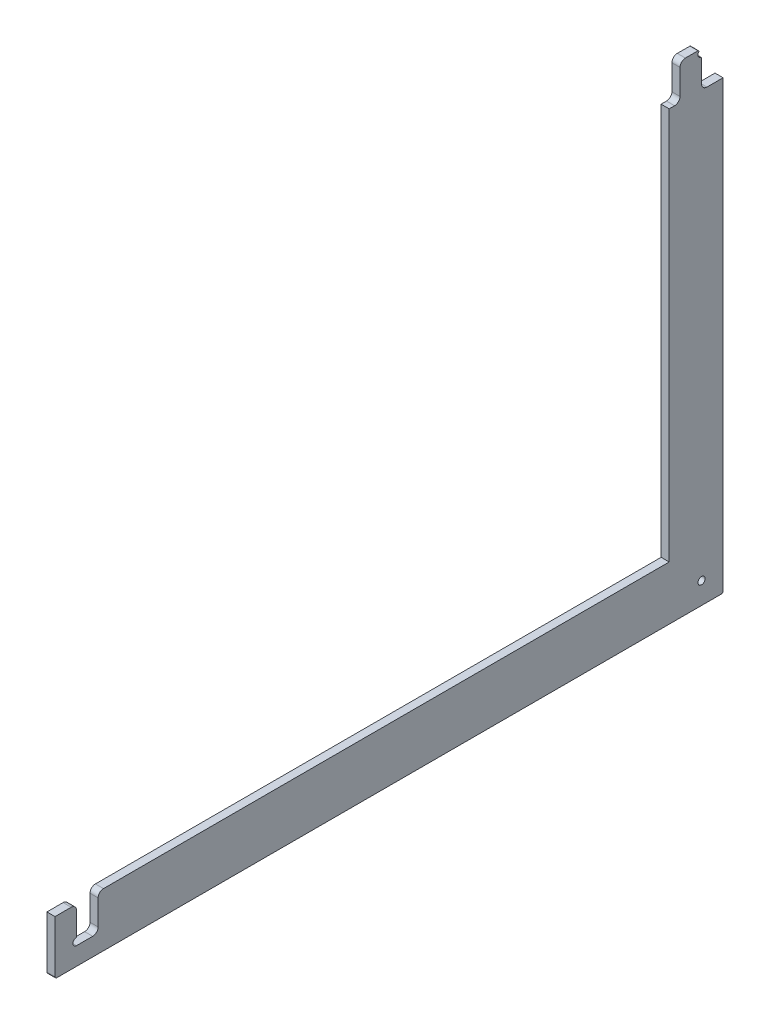
ISO-10303-21;
HEADER;
FILE_DESCRIPTION(('STEP AP214'),'2;1');
FILE_NAME('part.step','',(''),(''),'','','');
FILE_SCHEMA(('AUTOMOTIVE_DESIGN { 1 0 10303 214 1 1 1 1 }'));
ENDSEC;
DATA;
#1=APPLICATION_CONTEXT('core data for automotive mechanical design processes');
#2=APPLICATION_PROTOCOL_DEFINITION('international standard','automotive_design',2000,#1);
#3=PRODUCT_CONTEXT('',#1,'mechanical');
#4=PRODUCT('Part','Part','',(#3));
#5=PRODUCT_RELATED_PRODUCT_CATEGORY('part','',(#4));
#6=PRODUCT_DEFINITION_FORMATION('','',#4);
#7=PRODUCT_DEFINITION_CONTEXT('part definition',#1,'design');
#8=PRODUCT_DEFINITION('design','',#6,#7);
#9=PRODUCT_DEFINITION_SHAPE('','',#8);
#10=(LENGTH_UNIT() NAMED_UNIT(*) SI_UNIT(.MILLI.,.METRE.));
#11=(NAMED_UNIT(*) PLANE_ANGLE_UNIT() SI_UNIT($,.RADIAN.));
#12=(NAMED_UNIT(*) SI_UNIT($,.STERADIAN.) SOLID_ANGLE_UNIT());
#13=UNCERTAINTY_MEASURE_WITH_UNIT(LENGTH_MEASURE(1.E-05),#10,'distance_accuracy_value','');
#14=(GEOMETRIC_REPRESENTATION_CONTEXT(3) GLOBAL_UNCERTAINTY_ASSIGNED_CONTEXT((#13)) GLOBAL_UNIT_ASSIGNED_CONTEXT((#10,
#11,#12)) REPRESENTATION_CONTEXT('',''));
#15=CARTESIAN_POINT('',(0.,0.,0.));
#16=DIRECTION('',(0.,0.,1.));
#17=DIRECTION('',(1.,0.,0.));
#18=AXIS2_PLACEMENT_3D('',#15,#16,#17);
#19=CARTESIAN_POINT('',(4.5,0.,0.));
#20=DIRECTION('',(-1.,0.,0.));
#21=DIRECTION('',(0.,0.,1.));
#22=AXIS2_PLACEMENT_3D('',#19,#20,#21);
#23=PLANE('',#22);
#24=DIRECTION('',(0.,-1.,0.));
#25=VECTOR('',#24,1.);
#26=CARTESIAN_POINT('',(4.5,0.,372.));
#27=LINE('',#26,#25);
#28=CARTESIAN_POINT('',(4.5,30.,372.));
#29=VERTEX_POINT('',#28);
#30=CARTESIAN_POINT('',(4.5,1.,372.));
#31=VERTEX_POINT('',#30);
#32=EDGE_CURVE('E362',#29,#31,#27,.T.);
#33=ORIENTED_EDGE('',*,*,#32,.T.);
#34=CARTESIAN_POINT('',(4.5,1.,371.));
#35=DIRECTION('',(-1.,0.,0.));
#36=DIRECTION('',(0.,0.,1.));
#37=AXIS2_PLACEMENT_3D('',#34,#35,#36);
#38=CIRCLE('',#37,1.);
#39=CARTESIAN_POINT('',(4.5,0.,371.));
#40=VERTEX_POINT('',#39);
#41=EDGE_CURVE('E45',#31,#40,#38,.F.);
#42=ORIENTED_EDGE('',*,*,#41,.T.);
#43=DIRECTION('',(0.,0.,-1.));
#44=VECTOR('',#43,1.);
#45=CARTESIAN_POINT('',(4.5,0.,0.));
#46=LINE('',#45,#44);
#47=CARTESIAN_POINT('',(4.5,0.,1.));
#48=VERTEX_POINT('',#47);
#49=EDGE_CURVE('E361',#40,#48,#46,.T.);
#50=ORIENTED_EDGE('',*,*,#49,.T.);
#51=CARTESIAN_POINT('',(4.5,1.,1.));
#52=DIRECTION('',(-1.,0.,0.));
#53=DIRECTION('',(0.,0.,1.));
#54=AXIS2_PLACEMENT_3D('',#51,#52,#53);
#55=CIRCLE('',#54,1.);
#56=CARTESIAN_POINT('',(4.5,1.00000000000006,0.));
#57=VERTEX_POINT('',#56);
#58=EDGE_CURVE('E52',#48,#57,#55,.F.);
#59=ORIENTED_EDGE('',*,*,#58,.T.);
#60=DIRECTION('',(0.,1.,0.));
#61=VECTOR('',#60,1.);
#62=CARTESIAN_POINT('',(4.5,248.5,0.));
#63=LINE('',#62,#61);
#64=CARTESIAN_POINT('',(4.5,248.5,0.));
#65=VERTEX_POINT('',#64);
#66=EDGE_CURVE('E370',#57,#65,#63,.T.);
#67=ORIENTED_EDGE('',*,*,#66,.T.);
#68=DIRECTION('',(0.,0.,1.));
#69=VECTOR('',#68,1.);
#70=CARTESIAN_POINT('',(4.5,248.5,12.0000000000001));
#71=LINE('',#70,#69);
#72=CARTESIAN_POINT('',(4.5,248.5,9.00000000000008));
#73=VERTEX_POINT('',#72);
#74=EDGE_CURVE('E422',#65,#73,#71,.T.);
#75=ORIENTED_EDGE('',*,*,#74,.T.);
#76=CARTESIAN_POINT('',(4.5,251.5,9.00000000000008));
#77=DIRECTION('',(-1.,0.,0.));
#78=DIRECTION('',(0.,0.,1.));
#79=AXIS2_PLACEMENT_3D('',#76,#77,#78);
#80=CIRCLE('',#79,3.);
#81=CARTESIAN_POINT('',(4.5,251.5,12.0000000000001));
#82=VERTEX_POINT('',#81);
#83=EDGE_CURVE('E331',#73,#82,#80,.T.);
#84=ORIENTED_EDGE('',*,*,#83,.T.);
#85=DIRECTION('',(0.,1.,0.));
#86=VECTOR('',#85,1.);
#87=CARTESIAN_POINT('',(4.5,268.5,12.0000000000001));
#88=LINE('',#87,#86);
#89=CARTESIAN_POINT('',(4.5,264.050510257217,12.0000000000001));
#90=VERTEX_POINT('',#89);
#91=EDGE_CURVE('E425',#82,#90,#88,.T.);
#92=ORIENTED_EDGE('',*,*,#91,.T.);
#93=CARTESIAN_POINT('',(4.5,264.050510257217,12.5000000000001));
#94=DIRECTION('',(-1.,0.,0.));
#95=DIRECTION('',(0.,0.,1.));
#96=AXIS2_PLACEMENT_3D('',#93,#94,#95);
#97=CIRCLE('',#96,0.5);
#98=CARTESIAN_POINT('',(4.5,264.540408205774,12.4));
#99=VERTEX_POINT('',#98);
#100=EDGE_CURVE('E269',#90,#99,#97,.F.);
#101=ORIENTED_EDGE('',*,*,#100,.T.);
#102=CARTESIAN_POINT('',(4.5,266.5,11.9999999999998));
#103=DIRECTION('',(1.,0.,0.));
#104=DIRECTION('',(0.,0.,-1.));
#105=AXIS2_PLACEMENT_3D('',#102,#103,#104);
#106=CIRCLE('',#105,2.);
#107=CARTESIAN_POINT('',(4.5,267.7,13.5999999999998));
#108=VERTEX_POINT('',#107);
#109=EDGE_CURVE('E240',#108,#99,#106,.T.);
#110=ORIENTED_EDGE('',*,*,#109,.F.);
#111=CARTESIAN_POINT('',(4.5,268.,13.9999999999998));
#112=DIRECTION('',(-1.,0.,0.));
#113=DIRECTION('',(0.,0.,1.));
#114=AXIS2_PLACEMENT_3D('',#111,#112,#113);
#115=CIRCLE('',#114,0.5);
#116=CARTESIAN_POINT('',(4.5,268.5,13.9999999999998));
#117=VERTEX_POINT('',#116);
#118=EDGE_CURVE('E285',#108,#117,#115,.F.);
#119=ORIENTED_EDGE('',*,*,#118,.T.);
#120=DIRECTION('',(0.,0.,1.));
#121=VECTOR('',#120,1.);
#122=CARTESIAN_POINT('',(4.5,268.5,24.));
#123=LINE('',#122,#121);
#124=CARTESIAN_POINT('',(4.5,268.5,21.));
#125=VERTEX_POINT('',#124);
#126=EDGE_CURVE('E427',#117,#125,#123,.T.);
#127=ORIENTED_EDGE('',*,*,#126,.T.);
#128=CARTESIAN_POINT('',(4.5,265.5,21.));
#129=DIRECTION('',(-1.,0.,0.));
#130=DIRECTION('',(0.,0.,1.));
#131=AXIS2_PLACEMENT_3D('',#128,#129,#130);
#132=CIRCLE('',#131,3.);
#133=CARTESIAN_POINT('',(4.5,265.5,24.));
#134=VERTEX_POINT('',#133);
#135=EDGE_CURVE('E344',#125,#134,#132,.F.);
#136=ORIENTED_EDGE('',*,*,#135,.T.);
#137=DIRECTION('',(0.,-1.,0.));
#138=VECTOR('',#137,1.);
#139=CARTESIAN_POINT('',(4.5,248.5,24.));
#140=LINE('',#139,#138);
#141=CARTESIAN_POINT('',(4.5,251.5,24.));
#142=VERTEX_POINT('',#141);
#143=EDGE_CURVE('E430',#134,#142,#140,.T.);
#144=ORIENTED_EDGE('',*,*,#143,.T.);
#145=CARTESIAN_POINT('',(4.5,251.5,27.));
#146=DIRECTION('',(-1.,0.,0.));
#147=DIRECTION('',(0.,0.,1.));
#148=AXIS2_PLACEMENT_3D('',#145,#146,#147);
#149=CIRCLE('',#148,3.);
#150=CARTESIAN_POINT('',(4.5,248.5,27.));
#151=VERTEX_POINT('',#150);
#152=EDGE_CURVE('E327',#142,#151,#149,.T.);
#153=ORIENTED_EDGE('',*,*,#152,.T.);
#154=DIRECTION('',(0.,0.,1.));
#155=VECTOR('',#154,1.);
#156=CARTESIAN_POINT('',(4.5,248.5,30.));
#157=LINE('',#156,#155);
#158=CARTESIAN_POINT('',(4.5,248.5,30.));
#159=VERTEX_POINT('',#158);
#160=EDGE_CURVE('E432',#151,#159,#157,.T.);
#161=ORIENTED_EDGE('',*,*,#160,.T.);
#162=DIRECTION('',(0.,-1.,0.));
#163=VECTOR('',#162,1.);
#164=CARTESIAN_POINT('',(4.5,30.,30.));
#165=LINE('',#164,#163);
#166=CARTESIAN_POINT('',(4.5,30.,30.));
#167=VERTEX_POINT('',#166);
#168=EDGE_CURVE('E434',#159,#167,#165,.T.);
#169=ORIENTED_EDGE('',*,*,#168,.T.);
#170=DIRECTION('',(0.,0.,1.));
#171=VECTOR('',#170,1.);
#172=CARTESIAN_POINT('',(4.5,30.,30.));
#173=LINE('',#172,#171);
#174=CARTESIAN_POINT('',(4.5,30.,345.));
#175=VERTEX_POINT('',#174);
#176=EDGE_CURVE('E436',#167,#175,#173,.T.);
#177=ORIENTED_EDGE('',*,*,#176,.T.);
#178=CARTESIAN_POINT('',(4.5,27.,345.));
#179=DIRECTION('',(-1.,0.,0.));
#180=DIRECTION('',(0.,0.,1.));
#181=AXIS2_PLACEMENT_3D('',#178,#179,#180);
#182=CIRCLE('',#181,3.);
#183=CARTESIAN_POINT('',(4.5,27.,348.));
#184=VERTEX_POINT('',#183);
#185=EDGE_CURVE('E317',#175,#184,#182,.F.);
#186=ORIENTED_EDGE('',*,*,#185,.T.);
#187=DIRECTION('',(0.,-1.,0.));
#188=VECTOR('',#187,1.);
#189=CARTESIAN_POINT('',(4.5,9.99999999999997,348.));
#190=LINE('',#189,#188);
#191=CARTESIAN_POINT('',(4.5,13.,348.));
#192=VERTEX_POINT('',#191);
#193=EDGE_CURVE('E231',#184,#192,#190,.T.);
#194=ORIENTED_EDGE('',*,*,#193,.T.);
#195=CARTESIAN_POINT('',(4.5,13.,351.));
#196=DIRECTION('',(-1.,0.,0.));
#197=DIRECTION('',(0.,0.,1.));
#198=AXIS2_PLACEMENT_3D('',#195,#196,#197);
#199=CIRCLE('',#198,3.);
#200=CARTESIAN_POINT('',(4.5,9.99999999999997,351.));
#201=VERTEX_POINT('',#200);
#202=EDGE_CURVE('E225',#192,#201,#199,.T.);
#203=ORIENTED_EDGE('',*,*,#202,.T.);
#204=DIRECTION('',(0.,0.,1.));
#205=VECTOR('',#204,1.);
#206=CARTESIAN_POINT('',(4.5,9.99999999999997,360.));
#207=LINE('',#206,#205);
#208=CARTESIAN_POINT('',(4.5,10.0000000000059,360.));
#209=VERTEX_POINT('',#208);
#210=EDGE_CURVE('E218',#201,#209,#207,.T.);
#211=ORIENTED_EDGE('',*,*,#210,.T.);
#212=CARTESIAN_POINT('',(4.5,12.,360.));
#213=DIRECTION('',(1.,0.,0.));
#214=DIRECTION('',(0.,0.,-1.));
#215=AXIS2_PLACEMENT_3D('',#212,#213,#214);
#216=CIRCLE('',#215,1.99999999999407);
#217=CARTESIAN_POINT('',(4.5,13.9595917942205,360.4));
#218=VERTEX_POINT('',#217);
#219=EDGE_CURVE('E221',#218,#209,#216,.T.);
#220=ORIENTED_EDGE('',*,*,#219,.F.);
#221=CARTESIAN_POINT('',(4.5,14.4494897427771,360.5));
#222=DIRECTION('',(-1.,0.,0.));
#223=DIRECTION('',(0.,0.,1.));
#224=AXIS2_PLACEMENT_3D('',#221,#222,#223);
#225=CIRCLE('',#224,0.5);
#226=CARTESIAN_POINT('',(4.5,14.4494897427771,360.));
#227=VERTEX_POINT('',#226);
#228=EDGE_CURVE('E293',#218,#227,#225,.F.);
#229=ORIENTED_EDGE('',*,*,#228,.T.);
#230=DIRECTION('',(0.,1.,0.));
#231=VECTOR('',#230,1.);
#232=CARTESIAN_POINT('',(4.5,30.,360.));
#233=LINE('',#232,#231);
#234=CARTESIAN_POINT('',(4.5,27.,360.));
#235=VERTEX_POINT('',#234);
#236=EDGE_CURVE('E230',#227,#235,#233,.T.);
#237=ORIENTED_EDGE('',*,*,#236,.T.);
#238=CARTESIAN_POINT('',(4.5,27.,363.));
#239=DIRECTION('',(-1.,0.,0.));
#240=DIRECTION('',(0.,0.,1.));
#241=AXIS2_PLACEMENT_3D('',#238,#239,#240);
#242=CIRCLE('',#241,3.);
#243=CARTESIAN_POINT('',(4.5,30.,363.));
#244=VERTEX_POINT('',#243);
#245=EDGE_CURVE('E315',#235,#244,#242,.F.);
#246=ORIENTED_EDGE('',*,*,#245,.T.);
#247=DIRECTION('',(0.,0.,1.));
#248=VECTOR('',#247,1.);
#249=CARTESIAN_POINT('',(4.5,30.,360.));
#250=LINE('',#249,#248);
#251=EDGE_CURVE('E410',#244,#29,#250,.T.);
#252=ORIENTED_EDGE('',*,*,#251,.T.);
#253=EDGE_LOOP('',(#33,#42,#50,#59,#67,#75,#84,#92,#101,#110,#119,#127,#136,#144,#153,#161,#169,
#177,#186,#194,#203,#211,#220,#229,#237,#246,#252));
#254=FACE_BOUND('',#253,.T.);
#255=CARTESIAN_POINT('',(4.5,12.,12.));
#256=DIRECTION('',(1.,0.,0.));
#257=DIRECTION('',(0.,0.,-1.));
#258=AXIS2_PLACEMENT_3D('',#255,#256,#257);
#259=CIRCLE('',#258,2.);
#260=CARTESIAN_POINT('',(4.5,12.,9.99999999999997));
#261=VERTEX_POINT('',#260);
#262=EDGE_CURVE('E386',#261,#261,#259,.T.);
#263=ORIENTED_EDGE('',*,*,#262,.F.);
#264=EDGE_LOOP('',(#263));
#265=FACE_BOUND('',#264,.T.);
#266=ADVANCED_FACE('F37',(#254,#265),#23,.F.);
#267=CARTESIAN_POINT('',(0.,0.,0.));
#268=DIRECTION('',(-1.,0.,0.));
#269=DIRECTION('',(0.,0.,1.));
#270=AXIS2_PLACEMENT_3D('',#267,#268,#269);
#271=PLANE('',#270);
#272=DIRECTION('',(0.,0.,-1.));
#273=VECTOR('',#272,1.);
#274=CARTESIAN_POINT('',(0.,0.,0.));
#275=LINE('',#274,#273);
#276=CARTESIAN_POINT('',(0.,0.,371.));
#277=VERTEX_POINT('',#276);
#278=CARTESIAN_POINT('',(0.,0.,1.));
#279=VERTEX_POINT('',#278);
#280=EDGE_CURVE('E379',#277,#279,#275,.T.);
#281=ORIENTED_EDGE('',*,*,#280,.F.);
#282=CARTESIAN_POINT('',(0.,1.,371.));
#283=DIRECTION('',(-1.,0.,0.));
#284=DIRECTION('',(0.,0.,1.));
#285=AXIS2_PLACEMENT_3D('',#282,#283,#284);
#286=CIRCLE('',#285,1.);
#287=CARTESIAN_POINT('',(0.,1.,372.));
#288=VERTEX_POINT('',#287);
#289=EDGE_CURVE('E356',#277,#288,#286,.T.);
#290=ORIENTED_EDGE('',*,*,#289,.T.);
#291=DIRECTION('',(0.,-1.,0.));
#292=VECTOR('',#291,1.);
#293=CARTESIAN_POINT('',(0.,0.,372.));
#294=LINE('',#293,#292);
#295=CARTESIAN_POINT('',(0.,30.,372.));
#296=VERTEX_POINT('',#295);
#297=EDGE_CURVE('E378',#296,#288,#294,.T.);
#298=ORIENTED_EDGE('',*,*,#297,.F.);
#299=DIRECTION('',(0.,0.,1.));
#300=VECTOR('',#299,1.);
#301=CARTESIAN_POINT('',(0.,30.,360.));
#302=LINE('',#301,#300);
#303=CARTESIAN_POINT('',(0.,30.,363.));
#304=VERTEX_POINT('',#303);
#305=EDGE_CURVE('E382',#304,#296,#302,.T.);
#306=ORIENTED_EDGE('',*,*,#305,.F.);
#307=CARTESIAN_POINT('',(0.,27.,363.));
#308=DIRECTION('',(-1.,0.,0.));
#309=DIRECTION('',(0.,0.,1.));
#310=AXIS2_PLACEMENT_3D('',#307,#308,#309);
#311=CIRCLE('',#310,3.);
#312=CARTESIAN_POINT('',(0.,27.,360.));
#313=VERTEX_POINT('',#312);
#314=EDGE_CURVE('E309',#304,#313,#311,.T.);
#315=ORIENTED_EDGE('',*,*,#314,.T.);
#316=DIRECTION('',(0.,1.,0.));
#317=VECTOR('',#316,1.);
#318=CARTESIAN_POINT('',(0.,30.,360.));
#319=LINE('',#318,#317);
#320=CARTESIAN_POINT('',(0.,14.4494897427771,360.));
#321=VERTEX_POINT('',#320);
#322=EDGE_CURVE('E255',#321,#313,#319,.T.);
#323=ORIENTED_EDGE('',*,*,#322,.F.);
#324=CARTESIAN_POINT('',(0.,14.4494897427771,360.5));
#325=DIRECTION('',(-1.,0.,0.));
#326=DIRECTION('',(0.,0.,1.));
#327=AXIS2_PLACEMENT_3D('',#324,#325,#326);
#328=CIRCLE('',#327,0.5);
#329=CARTESIAN_POINT('',(0.,13.9595917942205,360.4));
#330=VERTEX_POINT('',#329);
#331=EDGE_CURVE('E290',#321,#330,#328,.T.);
#332=ORIENTED_EDGE('',*,*,#331,.T.);
#333=CARTESIAN_POINT('',(0.,12.,360.));
#334=DIRECTION('',(1.,0.,0.));
#335=DIRECTION('',(0.,0.,-1.));
#336=AXIS2_PLACEMENT_3D('',#333,#334,#335);
#337=CIRCLE('',#336,1.99999999999407);
#338=CARTESIAN_POINT('',(0.,10.0000000000059,360.));
#339=VERTEX_POINT('',#338);
#340=EDGE_CURVE('E241',#330,#339,#337,.T.);
#341=ORIENTED_EDGE('',*,*,#340,.T.);
#342=DIRECTION('',(0.,0.,1.));
#343=VECTOR('',#342,1.);
#344=CARTESIAN_POINT('',(0.,9.99999999999997,360.));
#345=LINE('',#344,#343);
#346=CARTESIAN_POINT('',(0.,9.99999999999997,351.));
#347=VERTEX_POINT('',#346);
#348=EDGE_CURVE('E245',#347,#339,#345,.T.);
#349=ORIENTED_EDGE('',*,*,#348,.F.);
#350=CARTESIAN_POINT('',(0.,13.,351.));
#351=DIRECTION('',(-1.,0.,0.));
#352=DIRECTION('',(0.,0.,1.));
#353=AXIS2_PLACEMENT_3D('',#350,#351,#352);
#354=CIRCLE('',#353,3.);
#355=CARTESIAN_POINT('',(0.,13.,348.));
#356=VERTEX_POINT('',#355);
#357=EDGE_CURVE('E346',#347,#356,#354,.F.);
#358=ORIENTED_EDGE('',*,*,#357,.T.);
#359=DIRECTION('',(0.,-1.,0.));
#360=VECTOR('',#359,1.);
#361=CARTESIAN_POINT('',(0.,9.99999999999997,348.));
#362=LINE('',#361,#360);
#363=CARTESIAN_POINT('',(0.,27.,348.));
#364=VERTEX_POINT('',#363);
#365=EDGE_CURVE('E407',#364,#356,#362,.T.);
#366=ORIENTED_EDGE('',*,*,#365,.F.);
#367=CARTESIAN_POINT('',(0.,27.,345.));
#368=DIRECTION('',(-1.,0.,0.));
#369=DIRECTION('',(0.,0.,1.));
#370=AXIS2_PLACEMENT_3D('',#367,#368,#369);
#371=CIRCLE('',#370,3.);
#372=CARTESIAN_POINT('',(0.,30.,345.));
#373=VERTEX_POINT('',#372);
#374=EDGE_CURVE('E311',#364,#373,#371,.T.);
#375=ORIENTED_EDGE('',*,*,#374,.T.);
#376=DIRECTION('',(0.,0.,1.));
#377=VECTOR('',#376,1.);
#378=CARTESIAN_POINT('',(0.,30.,30.));
#379=LINE('',#378,#377);
#380=CARTESIAN_POINT('',(0.,30.,30.));
#381=VERTEX_POINT('',#380);
#382=EDGE_CURVE('E404',#381,#373,#379,.T.);
#383=ORIENTED_EDGE('',*,*,#382,.F.);
#384=DIRECTION('',(0.,-1.,0.));
#385=VECTOR('',#384,1.);
#386=CARTESIAN_POINT('',(0.,30.,30.));
#387=LINE('',#386,#385);
#388=CARTESIAN_POINT('',(0.,248.5,30.));
#389=VERTEX_POINT('',#388);
#390=EDGE_CURVE('E402',#389,#381,#387,.T.);
#391=ORIENTED_EDGE('',*,*,#390,.F.);
#392=DIRECTION('',(0.,0.,1.));
#393=VECTOR('',#392,1.);
#394=CARTESIAN_POINT('',(0.,248.5,30.));
#395=LINE('',#394,#393);
#396=CARTESIAN_POINT('',(0.,248.5,27.));
#397=VERTEX_POINT('',#396);
#398=EDGE_CURVE('E400',#397,#389,#395,.T.);
#399=ORIENTED_EDGE('',*,*,#398,.F.);
#400=CARTESIAN_POINT('',(0.,251.5,27.));
#401=DIRECTION('',(-1.,0.,0.));
#402=DIRECTION('',(0.,0.,1.));
#403=AXIS2_PLACEMENT_3D('',#400,#401,#402);
#404=CIRCLE('',#403,3.);
#405=CARTESIAN_POINT('',(0.,251.5,24.));
#406=VERTEX_POINT('',#405);
#407=EDGE_CURVE('E324',#397,#406,#404,.F.);
#408=ORIENTED_EDGE('',*,*,#407,.T.);
#409=DIRECTION('',(0.,-1.,0.));
#410=VECTOR('',#409,1.);
#411=CARTESIAN_POINT('',(0.,248.5,24.));
#412=LINE('',#411,#410);
#413=CARTESIAN_POINT('',(0.,265.5,24.));
#414=VERTEX_POINT('',#413);
#415=EDGE_CURVE('E398',#414,#406,#412,.T.);
#416=ORIENTED_EDGE('',*,*,#415,.F.);
#417=CARTESIAN_POINT('',(0.,265.5,21.));
#418=DIRECTION('',(-1.,0.,0.));
#419=DIRECTION('',(0.,0.,1.));
#420=AXIS2_PLACEMENT_3D('',#417,#418,#419);
#421=CIRCLE('',#420,3.);
#422=CARTESIAN_POINT('',(0.,268.5,21.));
#423=VERTEX_POINT('',#422);
#424=EDGE_CURVE('E340',#414,#423,#421,.T.);
#425=ORIENTED_EDGE('',*,*,#424,.T.);
#426=DIRECTION('',(0.,0.,1.));
#427=VECTOR('',#426,1.);
#428=CARTESIAN_POINT('',(0.,268.5,24.));
#429=LINE('',#428,#427);
#430=CARTESIAN_POINT('',(0.,268.5,13.9999999999998));
#431=VERTEX_POINT('',#430);
#432=EDGE_CURVE('E395',#431,#423,#429,.T.);
#433=ORIENTED_EDGE('',*,*,#432,.F.);
#434=CARTESIAN_POINT('',(0.,268.,13.9999999999998));
#435=DIRECTION('',(-1.,0.,0.));
#436=DIRECTION('',(0.,0.,1.));
#437=AXIS2_PLACEMENT_3D('',#434,#435,#436);
#438=CIRCLE('',#437,0.5);
#439=CARTESIAN_POINT('',(0.,267.7,13.5999999999998));
#440=VERTEX_POINT('',#439);
#441=EDGE_CURVE('E281',#431,#440,#438,.T.);
#442=ORIENTED_EDGE('',*,*,#441,.T.);
#443=CARTESIAN_POINT('',(0.,266.5,11.9999999999998));
#444=DIRECTION('',(1.,0.,0.));
#445=DIRECTION('',(0.,0.,-1.));
#446=AXIS2_PLACEMENT_3D('',#443,#444,#445);
#447=CIRCLE('',#446,2.);
#448=CARTESIAN_POINT('',(0.,264.540408205774,12.4));
#449=VERTEX_POINT('',#448);
#450=EDGE_CURVE('E453',#440,#449,#447,.T.);
#451=ORIENTED_EDGE('',*,*,#450,.T.);
#452=CARTESIAN_POINT('',(0.,264.050510257217,12.5000000000001));
#453=DIRECTION('',(-1.,0.,0.));
#454=DIRECTION('',(0.,0.,1.));
#455=AXIS2_PLACEMENT_3D('',#452,#453,#454);
#456=CIRCLE('',#455,0.5);
#457=CARTESIAN_POINT('',(0.,264.050510257217,12.0000000000001));
#458=VERTEX_POINT('',#457);
#459=EDGE_CURVE('E275',#449,#458,#456,.T.);
#460=ORIENTED_EDGE('',*,*,#459,.T.);
#461=DIRECTION('',(0.,1.,0.));
#462=VECTOR('',#461,1.);
#463=CARTESIAN_POINT('',(0.,268.5,12.0000000000001));
#464=LINE('',#463,#462);
#465=CARTESIAN_POINT('',(0.,251.5,12.0000000000001));
#466=VERTEX_POINT('',#465);
#467=EDGE_CURVE('E393',#466,#458,#464,.T.);
#468=ORIENTED_EDGE('',*,*,#467,.F.);
#469=CARTESIAN_POINT('',(0.,251.5,9.00000000000008));
#470=DIRECTION('',(-1.,0.,0.));
#471=DIRECTION('',(0.,0.,1.));
#472=AXIS2_PLACEMENT_3D('',#469,#470,#471);
#473=CIRCLE('',#472,3.);
#474=CARTESIAN_POINT('',(0.,248.5,9.00000000000008));
#475=VERTEX_POINT('',#474);
#476=EDGE_CURVE('E329',#466,#475,#473,.F.);
#477=ORIENTED_EDGE('',*,*,#476,.T.);
#478=DIRECTION('',(0.,0.,1.));
#479=VECTOR('',#478,1.);
#480=CARTESIAN_POINT('',(0.,248.5,12.0000000000001));
#481=LINE('',#480,#479);
#482=CARTESIAN_POINT('',(0.,248.5,0.));
#483=VERTEX_POINT('',#482);
#484=EDGE_CURVE('E390',#483,#475,#481,.T.);
#485=ORIENTED_EDGE('',*,*,#484,.F.);
#486=DIRECTION('',(0.,1.,0.));
#487=VECTOR('',#486,1.);
#488=CARTESIAN_POINT('',(0.,248.5,0.));
#489=LINE('',#488,#487);
#490=CARTESIAN_POINT('',(0.,1.00000000000006,0.));
#491=VERTEX_POINT('',#490);
#492=EDGE_CURVE('E384',#491,#483,#489,.T.);
#493=ORIENTED_EDGE('',*,*,#492,.F.);
#494=CARTESIAN_POINT('',(0.,1.,1.));
#495=DIRECTION('',(-1.,0.,0.));
#496=DIRECTION('',(0.,0.,1.));
#497=AXIS2_PLACEMENT_3D('',#494,#495,#496);
#498=CIRCLE('',#497,1.);
#499=EDGE_CURVE('E354',#491,#279,#498,.T.);
#500=ORIENTED_EDGE('',*,*,#499,.T.);
#501=EDGE_LOOP('',(#281,#290,#298,#306,#315,#323,#332,#341,#349,#358,#366,#375,#383,#391,#399,
#408,#416,#425,#433,#442,#451,#460,#468,#477,#485,#493,#500));
#502=FACE_BOUND('',#501,.T.);
#503=CARTESIAN_POINT('',(0.,12.,12.));
#504=DIRECTION('',(1.,0.,0.));
#505=DIRECTION('',(0.,0.,-1.));
#506=AXIS2_PLACEMENT_3D('',#503,#504,#505);
#507=CIRCLE('',#506,2.);
#508=CARTESIAN_POINT('',(0.,12.,9.99999999999997));
#509=VERTEX_POINT('',#508);
#510=EDGE_CURVE('E418',#509,#509,#507,.T.);
#511=ORIENTED_EDGE('',*,*,#510,.T.);
#512=EDGE_LOOP('',(#511));
#513=FACE_BOUND('',#512,.T.);
#514=ADVANCED_FACE('F375',(#502,#513),#271,.T.);
#515=CARTESIAN_POINT('',(4.5,30.,360.));
#516=DIRECTION('',(0.,-1.,0.));
#517=DIRECTION('',(0.,0.,-1.));
#518=AXIS2_PLACEMENT_3D('',#515,#516,#517);
#519=PLANE('',#518);
#520=ORIENTED_EDGE('',*,*,#251,.F.);
#521=DIRECTION('',(-1.,0.,0.));
#522=VECTOR('',#521,1.);
#523=CARTESIAN_POINT('',(4.5,30.,363.));
#524=LINE('',#523,#522);
#525=EDGE_CURVE('E319',#244,#304,#524,.T.);
#526=ORIENTED_EDGE('',*,*,#525,.T.);
#527=ORIENTED_EDGE('',*,*,#305,.T.);
#528=DIRECTION('',(-1.,0.,0.));
#529=VECTOR('',#528,1.);
#530=CARTESIAN_POINT('',(4.5,30.,372.));
#531=LINE('',#530,#529);
#532=EDGE_CURVE('E263',#29,#296,#531,.T.);
#533=ORIENTED_EDGE('',*,*,#532,.F.);
#534=EDGE_LOOP('',(#520,#526,#527,#533));
#535=FACE_BOUND('',#534,.T.);
#536=ADVANCED_FACE('F497',(#535),#519,.F.);
#537=CARTESIAN_POINT('',(4.5,0.,372.));
#538=DIRECTION('',(0.,0.,-1.));
#539=DIRECTION('',(-1.,0.,0.));
#540=AXIS2_PLACEMENT_3D('',#537,#538,#539);
#541=PLANE('',#540);
#542=ORIENTED_EDGE('',*,*,#297,.T.);
#543=DIRECTION('',(-1.,0.,0.));
#544=VECTOR('',#543,1.);
#545=CARTESIAN_POINT('',(4.5,1.,372.));
#546=LINE('',#545,#544);
#547=EDGE_CURVE('E60',#288,#31,#546,.F.);
#548=ORIENTED_EDGE('',*,*,#547,.T.);
#549=ORIENTED_EDGE('',*,*,#32,.F.);
#550=ORIENTED_EDGE('',*,*,#532,.T.);
#551=EDGE_LOOP('',(#542,#548,#549,#550));
#552=FACE_BOUND('',#551,.T.);
#553=ADVANCED_FACE('F380',(#552),#541,.F.);
#554=CARTESIAN_POINT('',(4.5,0.,0.));
#555=DIRECTION('',(0.,1.,0.));
#556=DIRECTION('',(0.,0.,1.));
#557=AXIS2_PLACEMENT_3D('',#554,#555,#556);
#558=PLANE('',#557);
#559=ORIENTED_EDGE('',*,*,#49,.F.);
#560=DIRECTION('',(-1.,0.,0.));
#561=VECTOR('',#560,1.);
#562=CARTESIAN_POINT('',(4.5,0.,371.));
#563=LINE('',#562,#561);
#564=EDGE_CURVE('E351',#40,#277,#563,.T.);
#565=ORIENTED_EDGE('',*,*,#564,.T.);
#566=ORIENTED_EDGE('',*,*,#280,.T.);
#567=DIRECTION('',(-1.,0.,0.));
#568=VECTOR('',#567,1.);
#569=CARTESIAN_POINT('',(4.5,0.,1.));
#570=LINE('',#569,#568);
#571=EDGE_CURVE('E349',#279,#48,#570,.F.);
#572=ORIENTED_EDGE('',*,*,#571,.T.);
#573=EDGE_LOOP('',(#559,#565,#566,#572));
#574=FACE_BOUND('',#573,.T.);
#575=ADVANCED_FACE('F366',(#574),#558,.F.);
#576=CARTESIAN_POINT('',(4.5,248.5,0.));
#577=DIRECTION('',(0.,0.,1.));
#578=DIRECTION('',(1.,0.,0.));
#579=AXIS2_PLACEMENT_3D('',#576,#577,#578);
#580=PLANE('',#579);
#581=ORIENTED_EDGE('',*,*,#66,.F.);
#582=DIRECTION('',(-1.,0.,0.));
#583=VECTOR('',#582,1.);
#584=CARTESIAN_POINT('',(4.5,1.,0.));
#585=LINE('',#584,#583);
#586=EDGE_CURVE('E11',#57,#491,#585,.T.);
#587=ORIENTED_EDGE('',*,*,#586,.T.);
#588=ORIENTED_EDGE('',*,*,#492,.T.);
#589=DIRECTION('',(-1.,0.,0.));
#590=VECTOR('',#589,1.);
#591=CARTESIAN_POINT('',(4.5,248.5,0.));
#592=LINE('',#591,#590);
#593=EDGE_CURVE('E260',#65,#483,#592,.T.);
#594=ORIENTED_EDGE('',*,*,#593,.F.);
#595=EDGE_LOOP('',(#581,#587,#588,#594));
#596=FACE_BOUND('',#595,.T.);
#597=ADVANCED_FACE('F484',(#596),#580,.F.);
#598=CARTESIAN_POINT('',(4.5,248.5,12.0000000000001));
#599=DIRECTION('',(0.,-1.,0.));
#600=DIRECTION('',(0.,0.,-1.));
#601=AXIS2_PLACEMENT_3D('',#598,#599,#600);
#602=PLANE('',#601);
#603=ORIENTED_EDGE('',*,*,#484,.T.);
#604=DIRECTION('',(-1.,0.,0.));
#605=VECTOR('',#604,1.);
#606=CARTESIAN_POINT('',(4.5,248.5,9.00000000000008));
#607=LINE('',#606,#605);
#608=EDGE_CURVE('E304',#475,#73,#607,.F.);
#609=ORIENTED_EDGE('',*,*,#608,.T.);
#610=ORIENTED_EDGE('',*,*,#74,.F.);
#611=ORIENTED_EDGE('',*,*,#593,.T.);
#612=EDGE_LOOP('',(#603,#609,#610,#611));
#613=FACE_BOUND('',#612,.T.);
#614=ADVANCED_FACE('F480',(#613),#602,.F.);
#615=CARTESIAN_POINT('',(4.5,268.5,12.0000000000001));
#616=DIRECTION('',(0.,0.,1.));
#617=DIRECTION('',(0.,-1.,0.));
#618=AXIS2_PLACEMENT_3D('',#615,#616,#617);
#619=PLANE('',#618);
#620=ORIENTED_EDGE('',*,*,#91,.F.);
#621=DIRECTION('',(-1.,0.,0.));
#622=VECTOR('',#621,1.);
#623=CARTESIAN_POINT('',(0.,251.5,12.0000000000001));
#624=LINE('',#623,#622);
#625=EDGE_CURVE('E301',#82,#466,#624,.T.);
#626=ORIENTED_EDGE('',*,*,#625,.T.);
#627=ORIENTED_EDGE('',*,*,#467,.T.);
#628=DIRECTION('',(1.,0.,0.));
#629=VECTOR('',#628,1.);
#630=CARTESIAN_POINT('',(4.5,264.050510257217,12.0000000000001));
#631=LINE('',#630,#629);
#632=EDGE_CURVE('E266',#458,#90,#631,.T.);
#633=ORIENTED_EDGE('',*,*,#632,.T.);
#634=EDGE_LOOP('',(#620,#626,#627,#633));
#635=FACE_BOUND('',#634,.T.);
#636=ADVANCED_FACE('F472',(#635),#619,.F.);
#637=CARTESIAN_POINT('',(4.5,268.5,24.));
#638=DIRECTION('',(0.,-1.,0.));
#639=DIRECTION('',(0.,0.,-1.));
#640=AXIS2_PLACEMENT_3D('',#637,#638,#639);
#641=PLANE('',#640);
#642=ORIENTED_EDGE('',*,*,#432,.T.);
#643=DIRECTION('',(-1.,0.,0.));
#644=VECTOR('',#643,1.);
#645=CARTESIAN_POINT('',(4.5,268.5,21.));
#646=LINE('',#645,#644);
#647=EDGE_CURVE('E342',#423,#125,#646,.F.);
#648=ORIENTED_EDGE('',*,*,#647,.T.);
#649=ORIENTED_EDGE('',*,*,#126,.F.);
#650=DIRECTION('',(1.,0.,0.));
#651=VECTOR('',#650,1.);
#652=CARTESIAN_POINT('',(4.5,268.5,13.9999999999998));
#653=LINE('',#652,#651);
#654=EDGE_CURVE('E278',#117,#431,#653,.F.);
#655=ORIENTED_EDGE('',*,*,#654,.T.);
#656=EDGE_LOOP('',(#642,#648,#649,#655));
#657=FACE_BOUND('',#656,.T.);
#658=ADVANCED_FACE('F526',(#657),#641,.F.);
#659=CARTESIAN_POINT('',(4.5,248.5,24.));
#660=DIRECTION('',(0.,0.,-1.));
#661=DIRECTION('',(0.,1.,0.));
#662=AXIS2_PLACEMENT_3D('',#659,#660,#661);
#663=PLANE('',#662);
#664=ORIENTED_EDGE('',*,*,#143,.F.);
#665=DIRECTION('',(-1.,0.,0.));
#666=VECTOR('',#665,1.);
#667=CARTESIAN_POINT('',(4.5,265.5,24.));
#668=LINE('',#667,#666);
#669=EDGE_CURVE('E337',#134,#414,#668,.T.);
#670=ORIENTED_EDGE('',*,*,#669,.T.);
#671=ORIENTED_EDGE('',*,*,#415,.T.);
#672=DIRECTION('',(-1.,0.,0.));
#673=VECTOR('',#672,1.);
#674=CARTESIAN_POINT('',(4.5,251.5,24.));
#675=LINE('',#674,#673);
#676=EDGE_CURVE('E298',#406,#142,#675,.F.);
#677=ORIENTED_EDGE('',*,*,#676,.T.);
#678=EDGE_LOOP('',(#664,#670,#671,#677));
#679=FACE_BOUND('',#678,.T.);
#680=ADVANCED_FACE('F522',(#679),#663,.F.);
#681=CARTESIAN_POINT('',(4.5,248.5,30.));
#682=DIRECTION('',(0.,-1.,0.));
#683=DIRECTION('',(0.,0.,-1.));
#684=AXIS2_PLACEMENT_3D('',#681,#682,#683);
#685=PLANE('',#684);
#686=ORIENTED_EDGE('',*,*,#160,.F.);
#687=DIRECTION('',(-1.,0.,0.));
#688=VECTOR('',#687,1.);
#689=CARTESIAN_POINT('',(0.,248.5,27.));
#690=LINE('',#689,#688);
#691=EDGE_CURVE('E295',#151,#397,#690,.T.);
#692=ORIENTED_EDGE('',*,*,#691,.T.);
#693=ORIENTED_EDGE('',*,*,#398,.T.);
#694=DIRECTION('',(-1.,0.,0.));
#695=VECTOR('',#694,1.);
#696=CARTESIAN_POINT('',(4.5,248.5,30.));
#697=LINE('',#696,#695);
#698=EDGE_CURVE('E250',#159,#389,#697,.T.);
#699=ORIENTED_EDGE('',*,*,#698,.F.);
#700=EDGE_LOOP('',(#686,#692,#693,#699));
#701=FACE_BOUND('',#700,.T.);
#702=ADVANCED_FACE('F518',(#701),#685,.F.);
#703=CARTESIAN_POINT('',(4.5,30.,30.));
#704=DIRECTION('',(0.,0.,-1.));
#705=DIRECTION('',(-1.,0.,0.));
#706=AXIS2_PLACEMENT_3D('',#703,#704,#705);
#707=PLANE('',#706);
#708=ORIENTED_EDGE('',*,*,#390,.T.);
#709=DIRECTION('',(-1.,0.,0.));
#710=VECTOR('',#709,1.);
#711=CARTESIAN_POINT('',(4.5,30.,30.));
#712=LINE('',#711,#710);
#713=EDGE_CURVE('E247',#167,#381,#712,.T.);
#714=ORIENTED_EDGE('',*,*,#713,.F.);
#715=ORIENTED_EDGE('',*,*,#168,.F.);
#716=ORIENTED_EDGE('',*,*,#698,.T.);
#717=EDGE_LOOP('',(#708,#714,#715,#716));
#718=FACE_BOUND('',#717,.T.);
#719=ADVANCED_FACE('F514',(#718),#707,.F.);
#720=CARTESIAN_POINT('',(4.5,30.,30.));
#721=DIRECTION('',(0.,-1.,0.));
#722=DIRECTION('',(0.,0.,-1.));
#723=AXIS2_PLACEMENT_3D('',#720,#721,#722);
#724=PLANE('',#723);
#725=ORIENTED_EDGE('',*,*,#382,.T.);
#726=DIRECTION('',(-1.,0.,0.));
#727=VECTOR('',#726,1.);
#728=CARTESIAN_POINT('',(4.5,30.,345.));
#729=LINE('',#728,#727);
#730=EDGE_CURVE('E313',#373,#175,#729,.F.);
#731=ORIENTED_EDGE('',*,*,#730,.T.);
#732=ORIENTED_EDGE('',*,*,#176,.F.);
#733=ORIENTED_EDGE('',*,*,#713,.T.);
#734=EDGE_LOOP('',(#725,#731,#732,#733));
#735=FACE_BOUND('',#734,.T.);
#736=ADVANCED_FACE('F511',(#735),#724,.F.);
#737=CARTESIAN_POINT('',(4.5,9.99999999999997,348.));
#738=DIRECTION('',(0.,0.,-1.));
#739=DIRECTION('',(-1.,0.,0.));
#740=AXIS2_PLACEMENT_3D('',#737,#738,#739);
#741=PLANE('',#740);
#742=ORIENTED_EDGE('',*,*,#365,.T.);
#743=DIRECTION('',(-1.,0.,0.));
#744=VECTOR('',#743,1.);
#745=CARTESIAN_POINT('',(4.5,13.,348.));
#746=LINE('',#745,#744);
#747=EDGE_CURVE('E335',#356,#192,#746,.F.);
#748=ORIENTED_EDGE('',*,*,#747,.T.);
#749=ORIENTED_EDGE('',*,*,#193,.F.);
#750=DIRECTION('',(-1.,0.,0.));
#751=VECTOR('',#750,1.);
#752=CARTESIAN_POINT('',(4.5,27.,348.));
#753=LINE('',#752,#751);
#754=EDGE_CURVE('E306',#184,#364,#753,.T.);
#755=ORIENTED_EDGE('',*,*,#754,.T.);
#756=EDGE_LOOP('',(#742,#748,#749,#755));
#757=FACE_BOUND('',#756,.T.);
#758=ADVANCED_FACE('F508',(#757),#741,.F.);
#759=CARTESIAN_POINT('',(4.5,9.99999999999997,360.));
#760=DIRECTION('',(0.,-1.,0.));
#761=DIRECTION('',(0.,0.,-1.));
#762=AXIS2_PLACEMENT_3D('',#759,#760,#761);
#763=PLANE('',#762);
#764=ORIENTED_EDGE('',*,*,#210,.F.);
#765=DIRECTION('',(-1.,0.,0.));
#766=VECTOR('',#765,1.);
#767=CARTESIAN_POINT('',(0.,9.99999999999997,351.));
#768=LINE('',#767,#766);
#769=EDGE_CURVE('E333',#201,#347,#768,.T.);
#770=ORIENTED_EDGE('',*,*,#769,.T.);
#771=ORIENTED_EDGE('',*,*,#348,.T.);
#772=DIRECTION('',(-1.,0.,0.));
#773=VECTOR('',#772,1.);
#774=CARTESIAN_POINT('',(4.5,9.99999999999997,360.));
#775=LINE('',#774,#773);
#776=EDGE_CURVE('E237',#209,#339,#775,.T.);
#777=ORIENTED_EDGE('',*,*,#776,.F.);
#778=EDGE_LOOP('',(#764,#770,#771,#777));
#779=FACE_BOUND('',#778,.T.);
#780=ADVANCED_FACE('F243',(#779),#763,.F.);
#781=CARTESIAN_POINT('',(4.5,30.,360.));
#782=DIRECTION('',(0.,0.,1.));
#783=DIRECTION('',(1.,0.,0.));
#784=AXIS2_PLACEMENT_3D('',#781,#782,#783);
#785=PLANE('',#784);
#786=ORIENTED_EDGE('',*,*,#322,.T.);
#787=DIRECTION('',(-1.,0.,0.));
#788=VECTOR('',#787,1.);
#789=CARTESIAN_POINT('',(4.5,27.,360.));
#790=LINE('',#789,#788);
#791=EDGE_CURVE('E322',#313,#235,#790,.F.);
#792=ORIENTED_EDGE('',*,*,#791,.T.);
#793=ORIENTED_EDGE('',*,*,#236,.F.);
#794=DIRECTION('',(1.,0.,0.));
#795=VECTOR('',#794,1.);
#796=CARTESIAN_POINT('',(4.5,14.4494897427771,360.));
#797=LINE('',#796,#795);
#798=EDGE_CURVE('E287',#227,#321,#797,.F.);
#799=ORIENTED_EDGE('',*,*,#798,.T.);
#800=EDGE_LOOP('',(#786,#792,#793,#799));
#801=FACE_BOUND('',#800,.T.);
#802=ADVANCED_FACE('F503',(#801),#785,.F.);
#803=CARTESIAN_POINT('',(4.5,12.,12.));
#804=DIRECTION('',(-1.,0.,0.));
#805=DIRECTION('',(0.,0.,1.));
#806=AXIS2_PLACEMENT_3D('',#803,#804,#805);
#807=CYLINDRICAL_SURFACE('',#806,2.);
#808=ORIENTED_EDGE('',*,*,#262,.T.);
#809=EDGE_LOOP('',(#808));
#810=FACE_BOUND('',#809,.T.);
#811=ORIENTED_EDGE('',*,*,#510,.F.);
#812=EDGE_LOOP('',(#811));
#813=FACE_BOUND('',#812,.T.);
#814=ADVANCED_FACE('F500',(#810,#813),#807,.F.);
#815=CARTESIAN_POINT('',(0.,12.,360.));
#816=DIRECTION('',(1.,0.,0.));
#817=DIRECTION('',(0.,0.,-1.));
#818=AXIS2_PLACEMENT_3D('',#815,#816,#817);
#819=CYLINDRICAL_SURFACE('',#818,1.99999999999407);
#820=ORIENTED_EDGE('',*,*,#340,.F.);
#821=DIRECTION('',(1.,0.,0.));
#822=VECTOR('',#821,1.);
#823=CARTESIAN_POINT('',(0.,13.9595917942205,360.4));
#824=LINE('',#823,#822);
#825=EDGE_CURVE('E239',#330,#218,#824,.T.);
#826=ORIENTED_EDGE('',*,*,#825,.T.);
#827=ORIENTED_EDGE('',*,*,#219,.T.);
#828=ORIENTED_EDGE('',*,*,#776,.T.);
#829=EDGE_LOOP('',(#820,#826,#827,#828));
#830=FACE_BOUND('',#829,.T.);
#831=ADVANCED_FACE('F236',(#830),#819,.F.);
#832=CARTESIAN_POINT('',(0.,266.5,11.9999999999998));
#833=DIRECTION('',(1.,0.,0.));
#834=DIRECTION('',(0.,0.,-1.));
#835=AXIS2_PLACEMENT_3D('',#832,#833,#834);
#836=CYLINDRICAL_SURFACE('',#835,2.);
#837=ORIENTED_EDGE('',*,*,#450,.F.);
#838=DIRECTION('',(1.,0.,0.));
#839=VECTOR('',#838,1.);
#840=CARTESIAN_POINT('',(0.,267.7,13.5999999999998));
#841=LINE('',#840,#839);
#842=EDGE_CURVE('E283',#440,#108,#841,.T.);
#843=ORIENTED_EDGE('',*,*,#842,.T.);
#844=ORIENTED_EDGE('',*,*,#109,.T.);
#845=DIRECTION('',(1.,0.,0.));
#846=VECTOR('',#845,1.);
#847=CARTESIAN_POINT('',(0.,264.540408205774,12.4));
#848=LINE('',#847,#846);
#849=EDGE_CURVE('E272',#99,#449,#848,.F.);
#850=ORIENTED_EDGE('',*,*,#849,.T.);
#851=EDGE_LOOP('',(#837,#843,#844,#850));
#852=FACE_BOUND('',#851,.T.);
#853=ADVANCED_FACE('F459',(#852),#836,.F.);
#854=CARTESIAN_POINT('',(0.,264.050510257217,12.5000000000001));
#855=DIRECTION('',(1.,0.,0.));
#856=DIRECTION('',(0.,0.,-1.));
#857=AXIS2_PLACEMENT_3D('',#854,#855,#856);
#858=CYLINDRICAL_SURFACE('',#857,0.5);
#859=ORIENTED_EDGE('',*,*,#459,.F.);
#860=ORIENTED_EDGE('',*,*,#849,.F.);
#861=ORIENTED_EDGE('',*,*,#100,.F.);
#862=ORIENTED_EDGE('',*,*,#632,.F.);
#863=EDGE_LOOP('',(#859,#860,#861,#862));
#864=FACE_BOUND('',#863,.T.);
#865=ADVANCED_FACE('F468',(#864),#858,.T.);
#866=CARTESIAN_POINT('',(0.,268.,13.9999999999998));
#867=DIRECTION('',(1.,0.,0.));
#868=DIRECTION('',(0.,0.,-1.));
#869=AXIS2_PLACEMENT_3D('',#866,#867,#868);
#870=CYLINDRICAL_SURFACE('',#869,0.5);
#871=ORIENTED_EDGE('',*,*,#118,.F.);
#872=ORIENTED_EDGE('',*,*,#842,.F.);
#873=ORIENTED_EDGE('',*,*,#441,.F.);
#874=ORIENTED_EDGE('',*,*,#654,.F.);
#875=EDGE_LOOP('',(#871,#872,#873,#874));
#876=FACE_BOUND('',#875,.T.);
#877=ADVANCED_FACE('F546',(#876),#870,.T.);
#878=CARTESIAN_POINT('',(0.,14.4494897427771,360.5));
#879=DIRECTION('',(1.,0.,0.));
#880=DIRECTION('',(0.,0.,-1.));
#881=AXIS2_PLACEMENT_3D('',#878,#879,#880);
#882=CYLINDRICAL_SURFACE('',#881,0.5);
#883=ORIENTED_EDGE('',*,*,#228,.F.);
#884=ORIENTED_EDGE('',*,*,#825,.F.);
#885=ORIENTED_EDGE('',*,*,#331,.F.);
#886=ORIENTED_EDGE('',*,*,#798,.F.);
#887=EDGE_LOOP('',(#883,#884,#885,#886));
#888=FACE_BOUND('',#887,.T.);
#889=ADVANCED_FACE('F549',(#888),#882,.T.);
#890=CARTESIAN_POINT('',(4.5,251.5,27.));
#891=DIRECTION('',(1.,0.,0.));
#892=DIRECTION('',(0.,0.,-1.));
#893=AXIS2_PLACEMENT_3D('',#890,#891,#892);
#894=CYLINDRICAL_SURFACE('',#893,3.);
#895=ORIENTED_EDGE('',*,*,#152,.F.);
#896=ORIENTED_EDGE('',*,*,#676,.F.);
#897=ORIENTED_EDGE('',*,*,#407,.F.);
#898=ORIENTED_EDGE('',*,*,#691,.F.);
#899=EDGE_LOOP('',(#895,#896,#897,#898));
#900=FACE_BOUND('',#899,.T.);
#901=ADVANCED_FACE('F553',(#900),#894,.F.);
#902=CARTESIAN_POINT('',(4.5,251.5,9.00000000000008));
#903=DIRECTION('',(1.,0.,0.));
#904=DIRECTION('',(0.,0.,-1.));
#905=AXIS2_PLACEMENT_3D('',#902,#903,#904);
#906=CYLINDRICAL_SURFACE('',#905,3.);
#907=ORIENTED_EDGE('',*,*,#83,.F.);
#908=ORIENTED_EDGE('',*,*,#608,.F.);
#909=ORIENTED_EDGE('',*,*,#476,.F.);
#910=ORIENTED_EDGE('',*,*,#625,.F.);
#911=EDGE_LOOP('',(#907,#908,#909,#910));
#912=FACE_BOUND('',#911,.T.);
#913=ADVANCED_FACE('F476',(#912),#906,.F.);
#914=CARTESIAN_POINT('',(4.5,27.,345.));
#915=DIRECTION('',(-1.,0.,0.));
#916=DIRECTION('',(0.,0.,1.));
#917=AXIS2_PLACEMENT_3D('',#914,#915,#916);
#918=CYLINDRICAL_SURFACE('',#917,3.);
#919=ORIENTED_EDGE('',*,*,#185,.F.);
#920=ORIENTED_EDGE('',*,*,#730,.F.);
#921=ORIENTED_EDGE('',*,*,#374,.F.);
#922=ORIENTED_EDGE('',*,*,#754,.F.);
#923=EDGE_LOOP('',(#919,#920,#921,#922));
#924=FACE_BOUND('',#923,.T.);
#925=ADVANCED_FACE('F560',(#924),#918,.T.);
#926=CARTESIAN_POINT('',(4.5,27.,363.));
#927=DIRECTION('',(-1.,0.,0.));
#928=DIRECTION('',(0.,0.,1.));
#929=AXIS2_PLACEMENT_3D('',#926,#927,#928);
#930=CYLINDRICAL_SURFACE('',#929,3.);
#931=ORIENTED_EDGE('',*,*,#245,.F.);
#932=ORIENTED_EDGE('',*,*,#791,.F.);
#933=ORIENTED_EDGE('',*,*,#314,.F.);
#934=ORIENTED_EDGE('',*,*,#525,.F.);
#935=EDGE_LOOP('',(#931,#932,#933,#934));
#936=FACE_BOUND('',#935,.T.);
#937=ADVANCED_FACE('F563',(#936),#930,.T.);
#938=CARTESIAN_POINT('',(4.5,13.,351.));
#939=DIRECTION('',(1.,0.,0.));
#940=DIRECTION('',(0.,0.,-1.));
#941=AXIS2_PLACEMENT_3D('',#938,#939,#940);
#942=CYLINDRICAL_SURFACE('',#941,3.);
#943=ORIENTED_EDGE('',*,*,#202,.F.);
#944=ORIENTED_EDGE('',*,*,#747,.F.);
#945=ORIENTED_EDGE('',*,*,#357,.F.);
#946=ORIENTED_EDGE('',*,*,#769,.F.);
#947=EDGE_LOOP('',(#943,#944,#945,#946));
#948=FACE_BOUND('',#947,.T.);
#949=ADVANCED_FACE('F445',(#948),#942,.F.);
#950=CARTESIAN_POINT('',(4.5,265.5,21.));
#951=DIRECTION('',(-1.,0.,0.));
#952=DIRECTION('',(0.,0.,1.));
#953=AXIS2_PLACEMENT_3D('',#950,#951,#952);
#954=CYLINDRICAL_SURFACE('',#953,3.);
#955=ORIENTED_EDGE('',*,*,#135,.F.);
#956=ORIENTED_EDGE('',*,*,#647,.F.);
#957=ORIENTED_EDGE('',*,*,#424,.F.);
#958=ORIENTED_EDGE('',*,*,#669,.F.);
#959=EDGE_LOOP('',(#955,#956,#957,#958));
#960=FACE_BOUND('',#959,.T.);
#961=ADVANCED_FACE('F491',(#960),#954,.T.);
#962=CARTESIAN_POINT('',(4.5,1.,371.));
#963=DIRECTION('',(-1.,0.,0.));
#964=DIRECTION('',(0.,0.,1.));
#965=AXIS2_PLACEMENT_3D('',#962,#963,#964);
#966=CYLINDRICAL_SURFACE('',#965,1.);
#967=ORIENTED_EDGE('',*,*,#41,.F.);
#968=ORIENTED_EDGE('',*,*,#547,.F.);
#969=ORIENTED_EDGE('',*,*,#289,.F.);
#970=ORIENTED_EDGE('',*,*,#564,.F.);
#971=EDGE_LOOP('',(#967,#968,#969,#970));
#972=FACE_BOUND('',#971,.T.);
#973=ADVANCED_FACE('F372',(#972),#966,.T.);
#974=CARTESIAN_POINT('',(4.5,1.,1.));
#975=DIRECTION('',(-1.,0.,0.));
#976=DIRECTION('',(0.,0.,1.));
#977=AXIS2_PLACEMENT_3D('',#974,#975,#976);
#978=CYLINDRICAL_SURFACE('',#977,1.);
#979=ORIENTED_EDGE('',*,*,#58,.F.);
#980=ORIENTED_EDGE('',*,*,#571,.F.);
#981=ORIENTED_EDGE('',*,*,#499,.F.);
#982=ORIENTED_EDGE('',*,*,#586,.F.);
#983=EDGE_LOOP('',(#979,#980,#981,#982));
#984=FACE_BOUND('',#983,.T.);
#985=ADVANCED_FACE('F39',(#984),#978,.T.);
#986=CLOSED_SHELL('',(#266,#514,#536,#553,#575,#597,#614,#636,#658,#680,#702,#719,#736,#758,
#780,#802,#814,#831,#853,#865,#877,#889,#901,#913,#925,#937,#949,#961,#973,#985));
#987=MANIFOLD_SOLID_BREP('B2',#986);
#988=ADVANCED_BREP_SHAPE_REPRESENTATION('',(#18,#987),#14);
#989=SHAPE_DEFINITION_REPRESENTATION(#9,#988);
ENDSEC;
END-ISO-10303-21;
